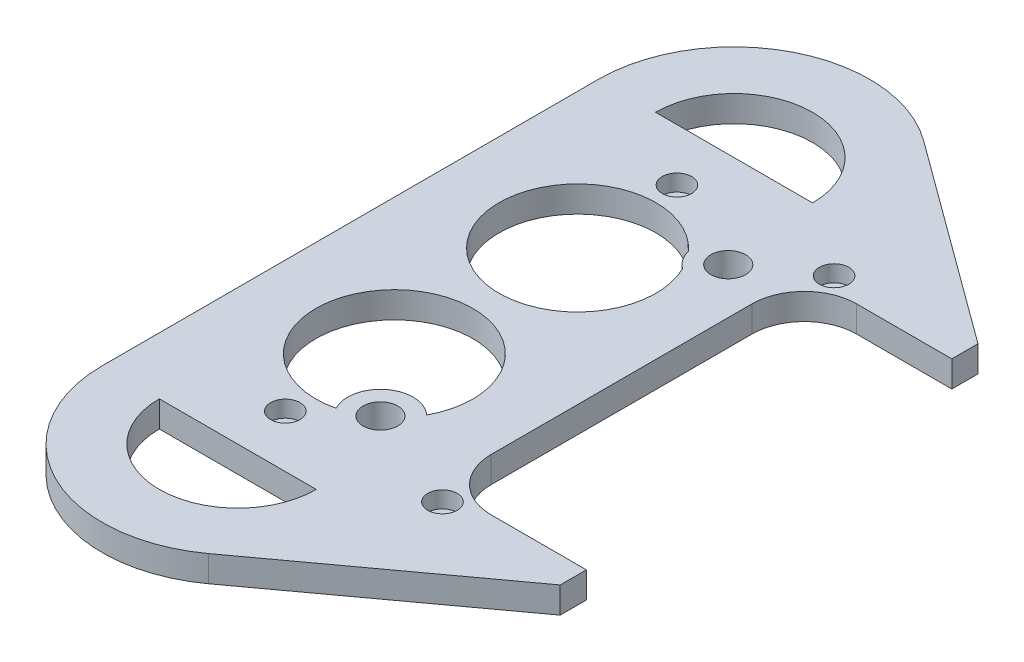
ISO-10303-21;
HEADER;
FILE_DESCRIPTION(('STEP AP214'),'2;1');
FILE_NAME('part.step','',(''),(''),'','','');
FILE_SCHEMA(('AUTOMOTIVE_DESIGN { 1 0 10303 214 1 1 1 1 }'));
ENDSEC;
DATA;
#1=APPLICATION_CONTEXT('core data for automotive mechanical design processes');
#2=APPLICATION_PROTOCOL_DEFINITION('international standard','automotive_design',2000,#1);
#3=PRODUCT_CONTEXT('',#1,'mechanical');
#4=PRODUCT('Part','Part','',(#3));
#5=PRODUCT_RELATED_PRODUCT_CATEGORY('part','',(#4));
#6=PRODUCT_DEFINITION_FORMATION('','',#4);
#7=PRODUCT_DEFINITION_CONTEXT('part definition',#1,'design');
#8=PRODUCT_DEFINITION('design','',#6,#7);
#9=PRODUCT_DEFINITION_SHAPE('','',#8);
#10=(LENGTH_UNIT() NAMED_UNIT(*) SI_UNIT(.MILLI.,.METRE.));
#11=(NAMED_UNIT(*) PLANE_ANGLE_UNIT() SI_UNIT($,.RADIAN.));
#12=(NAMED_UNIT(*) SI_UNIT($,.STERADIAN.) SOLID_ANGLE_UNIT());
#13=UNCERTAINTY_MEASURE_WITH_UNIT(LENGTH_MEASURE(1.E-05),#10,'distance_accuracy_value','');
#14=(GEOMETRIC_REPRESENTATION_CONTEXT(3) GLOBAL_UNCERTAINTY_ASSIGNED_CONTEXT((#13)) GLOBAL_UNIT_ASSIGNED_CONTEXT((#10,
#11,#12)) REPRESENTATION_CONTEXT('',''));
#15=CARTESIAN_POINT('',(0.,0.,0.));
#16=DIRECTION('',(0.,0.,1.));
#17=DIRECTION('',(1.,0.,0.));
#18=AXIS2_PLACEMENT_3D('',#15,#16,#17);
#19=CARTESIAN_POINT('',(-34.3669284746665,59.628467801772,9.525));
#20=DIRECTION('',(0.,-1.,0.));
#21=DIRECTION('',(0.,0.,-1.));
#22=AXIS2_PLACEMENT_3D('',#19,#20,#21);
#23=CYLINDRICAL_SURFACE('',#22,19.05);
#24=CARTESIAN_POINT('',(-34.3669284746665,53.278467801772,9.525));
#25=DIRECTION('',(0.,1.,0.));
#26=DIRECTION('',(0.,0.,1.));
#27=AXIS2_PLACEMENT_3D('',#24,#25,#26);
#28=CIRCLE('',#27,19.05);
#29=CARTESIAN_POINT('',(-53.4169284746665,53.278467801772,9.525));
#30=VERTEX_POINT('',#29);
#31=CARTESIAN_POINT('',(-15.3169284746665,53.278467801772,9.52500000000001));
#32=VERTEX_POINT('',#31);
#33=EDGE_CURVE('E193',#30,#32,#28,.T.);
#34=ORIENTED_EDGE('',*,*,#33,.F.);
#35=DIRECTION('',(0.,-1.,0.));
#36=VECTOR('',#35,1.);
#37=CARTESIAN_POINT('',(-53.4169284746665,59.628467801772,9.525));
#38=LINE('',#37,#36);
#39=CARTESIAN_POINT('',(-53.4169284746665,59.628467801772,9.525));
#40=VERTEX_POINT('',#39);
#41=EDGE_CURVE('E287',#40,#30,#38,.T.);
#42=ORIENTED_EDGE('',*,*,#41,.F.);
#43=CARTESIAN_POINT('',(-34.3669284746665,59.628467801772,9.525));
#44=DIRECTION('',(0.,1.,0.));
#45=DIRECTION('',(0.,0.,1.));
#46=AXIS2_PLACEMENT_3D('',#43,#44,#45);
#47=CIRCLE('',#46,19.05);
#48=CARTESIAN_POINT('',(-15.3169284746665,59.628467801772,9.52500000000001));
#49=VERTEX_POINT('',#48);
#50=EDGE_CURVE('E235',#40,#49,#47,.T.);
#51=ORIENTED_EDGE('',*,*,#50,.T.);
#52=DIRECTION('',(0.,-1.,0.));
#53=VECTOR('',#52,1.);
#54=CARTESIAN_POINT('',(-15.3169284746665,59.628467801772,9.52500000000001));
#55=LINE('',#54,#53);
#56=EDGE_CURVE('E285',#49,#32,#55,.T.);
#57=ORIENTED_EDGE('',*,*,#56,.T.);
#58=EDGE_LOOP('',(#34,#42,#51,#57));
#59=FACE_BOUND('',#58,.T.);
#60=ADVANCED_FACE('F34',(#59),#23,.F.);
#61=CARTESIAN_POINT('',(-34.3669284746665,59.628467801772,-110.914407138914));
#62=DIRECTION('',(0.,-1.,0.));
#63=DIRECTION('',(0.,0.,-1.));
#64=AXIS2_PLACEMENT_3D('',#61,#62,#63);
#65=CYLINDRICAL_SURFACE('',#64,19.05);
#66=CARTESIAN_POINT('',(-34.3669284746665,53.278467801772,-110.914407138914));
#67=DIRECTION('',(0.,1.,0.));
#68=DIRECTION('',(0.,0.,1.));
#69=AXIS2_PLACEMENT_3D('',#66,#67,#68);
#70=CIRCLE('',#69,19.05);
#71=CARTESIAN_POINT('',(-15.3169284746665,53.278467801772,-110.914407138914));
#72=VERTEX_POINT('',#71);
#73=CARTESIAN_POINT('',(-53.4169284746665,53.278467801772,-110.914407138914));
#74=VERTEX_POINT('',#73);
#75=EDGE_CURVE('E277',#72,#74,#70,.T.);
#76=ORIENTED_EDGE('',*,*,#75,.F.);
#77=DIRECTION('',(0.,-1.,0.));
#78=VECTOR('',#77,1.);
#79=CARTESIAN_POINT('',(-15.3169284746665,59.628467801772,-110.914407138914));
#80=LINE('',#79,#78);
#81=CARTESIAN_POINT('',(-15.3169284746665,59.628467801772,-110.914407138914));
#82=VERTEX_POINT('',#81);
#83=EDGE_CURVE('E288',#82,#72,#80,.T.);
#84=ORIENTED_EDGE('',*,*,#83,.F.);
#85=CARTESIAN_POINT('',(-34.3669284746665,59.628467801772,-110.914407138914));
#86=DIRECTION('',(0.,1.,0.));
#87=DIRECTION('',(0.,0.,1.));
#88=AXIS2_PLACEMENT_3D('',#85,#86,#87);
#89=CIRCLE('',#88,19.05);
#90=CARTESIAN_POINT('',(-53.4169284746665,59.628467801772,-110.914407138914));
#91=VERTEX_POINT('',#90);
#92=EDGE_CURVE('E230',#82,#91,#89,.T.);
#93=ORIENTED_EDGE('',*,*,#92,.T.);
#94=DIRECTION('',(0.,-1.,0.));
#95=VECTOR('',#94,1.);
#96=CARTESIAN_POINT('',(-53.4169284746665,59.628467801772,-110.914407138914));
#97=LINE('',#96,#95);
#98=EDGE_CURVE('E291',#91,#74,#97,.T.);
#99=ORIENTED_EDGE('',*,*,#98,.T.);
#100=EDGE_LOOP('',(#76,#84,#93,#99));
#101=FACE_BOUND('',#100,.T.);
#102=ADVANCED_FACE('F387',(#101),#65,.F.);
#103=CARTESIAN_POINT('',(-34.3669284746665,59.628467801772,-28.4697035694572));
#104=DIRECTION('',(0.,-1.,0.));
#105=DIRECTION('',(0.,0.,-1.));
#106=AXIS2_PLACEMENT_3D('',#103,#104,#105);
#107=CYLINDRICAL_SURFACE('',#106,19.05);
#108=CARTESIAN_POINT('',(-34.3669284746665,53.278467801772,-28.4697035694572));
#109=DIRECTION('',(0.,1.,0.));
#110=DIRECTION('',(0.,0.,1.));
#111=AXIS2_PLACEMENT_3D('',#108,#109,#110);
#112=CIRCLE('',#111,19.05);
#113=CARTESIAN_POINT('',(-17.5600046439116,53.278467801772,-19.5014366606725));
#114=VERTEX_POINT('',#113);
#115=CARTESIAN_POINT('',(-29.9619169320867,53.278467801772,-9.93599446119345));
#116=VERTEX_POINT('',#115);
#117=EDGE_CURVE('E271',#114,#116,#112,.T.);
#118=ORIENTED_EDGE('',*,*,#117,.F.);
#119=DIRECTION('',(0.,-1.,0.));
#120=VECTOR('',#119,1.);
#121=CARTESIAN_POINT('',(-17.5600046439116,59.628467801772,-19.5014366606725));
#122=LINE('',#121,#120);
#123=CARTESIAN_POINT('',(-17.5600046439116,59.628467801772,-19.5014366606725));
#124=VERTEX_POINT('',#123);
#125=EDGE_CURVE('E293',#124,#114,#122,.T.);
#126=ORIENTED_EDGE('',*,*,#125,.F.);
#127=CARTESIAN_POINT('',(-34.3669284746665,59.628467801772,-28.4697035694572));
#128=DIRECTION('',(0.,1.,0.));
#129=DIRECTION('',(0.,0.,1.));
#130=AXIS2_PLACEMENT_3D('',#127,#128,#129);
#131=CIRCLE('',#130,19.05);
#132=CARTESIAN_POINT('',(-29.9619169320867,59.628467801772,-9.93599446119345));
#133=VERTEX_POINT('',#132);
#134=EDGE_CURVE('E225',#124,#133,#131,.T.);
#135=ORIENTED_EDGE('',*,*,#134,.T.);
#136=DIRECTION('',(0.,-1.,0.));
#137=VECTOR('',#136,1.);
#138=CARTESIAN_POINT('',(-29.9619169320867,59.628467801772,-9.93599446119345));
#139=LINE('',#138,#137);
#140=EDGE_CURVE('E295',#133,#116,#139,.T.);
#141=ORIENTED_EDGE('',*,*,#140,.T.);
#142=EDGE_LOOP('',(#118,#126,#135,#141));
#143=FACE_BOUND('',#142,.T.);
#144=ADVANCED_FACE('F393',(#143),#107,.F.);
#145=CARTESIAN_POINT('',(-1.4507191224685,59.628467801772,0.));
#146=DIRECTION('',(1.,0.,0.));
#147=DIRECTION('',(0.,0.,-1.));
#148=AXIS2_PLACEMENT_3D('',#145,#146,#147);
#149=PLANE('',#148);
#150=DIRECTION('',(0.,0.,1.));
#151=VECTOR('',#150,1.);
#152=CARTESIAN_POINT('',(-1.4507191224685,53.278467801772,0.));
#153=LINE('',#152,#151);
#154=CARTESIAN_POINT('',(-1.4507191224685,53.278467801772,-82.3394036822282));
#155=VERTEX_POINT('',#154);
#156=CARTESIAN_POINT('',(-1.4507191224685,53.278467801772,-19.05));
#157=VERTEX_POINT('',#156);
#158=EDGE_CURVE('E244',#155,#157,#153,.T.);
#159=ORIENTED_EDGE('',*,*,#158,.F.);
#160=DIRECTION('',(0.,-1.,0.));
#161=VECTOR('',#160,1.);
#162=CARTESIAN_POINT('',(-1.4507191224685,59.628467801772,-82.3394036822282));
#163=LINE('',#162,#161);
#164=CARTESIAN_POINT('',(-1.4507191224685,59.628467801772,-82.3394036822282));
#165=VERTEX_POINT('',#164);
#166=EDGE_CURVE('E325',#155,#165,#163,.F.);
#167=ORIENTED_EDGE('',*,*,#166,.T.);
#168=DIRECTION('',(0.,0.,1.));
#169=VECTOR('',#168,1.);
#170=CARTESIAN_POINT('',(-1.4507191224685,59.628467801772,0.));
#171=LINE('',#170,#169);
#172=CARTESIAN_POINT('',(-1.4507191224685,59.628467801772,-19.05));
#173=VERTEX_POINT('',#172);
#174=EDGE_CURVE('E186',#165,#173,#171,.T.);
#175=ORIENTED_EDGE('',*,*,#174,.T.);
#176=DIRECTION('',(0.,-1.,0.));
#177=VECTOR('',#176,1.);
#178=CARTESIAN_POINT('',(-1.4507191224685,53.278467801772,-19.05));
#179=LINE('',#178,#177);
#180=EDGE_CURVE('E322',#173,#157,#179,.T.);
#181=ORIENTED_EDGE('',*,*,#180,.T.);
#182=EDGE_LOOP('',(#159,#167,#175,#181));
#183=FACE_BOUND('',#182,.T.);
#184=ADVANCED_FACE('F349',(#183),#149,.T.);
#185=CARTESIAN_POINT('',(0.,59.628467801772,-95.0394036822282));
#186=DIRECTION('',(0.,0.,-1.));
#187=DIRECTION('',(-1.,0.,0.));
#188=AXIS2_PLACEMENT_3D('',#185,#186,#187);
#189=PLANE('',#188);
#190=DIRECTION('',(1.,0.,0.));
#191=VECTOR('',#190,1.);
#192=CARTESIAN_POINT('',(0.,59.628467801772,-95.0394036822282));
#193=LINE('',#192,#191);
#194=CARTESIAN_POINT('',(11.2492808775315,59.628467801772,-95.0394036822282));
#195=VERTEX_POINT('',#194);
#196=CARTESIAN_POINT('',(34.354322218472,59.628467801772,-95.0394036822282));
#197=VERTEX_POINT('',#196);
#198=EDGE_CURVE('E201',#195,#197,#193,.T.);
#199=ORIENTED_EDGE('',*,*,#198,.F.);
#200=DIRECTION('',(0.,-1.,0.));
#201=VECTOR('',#200,1.);
#202=CARTESIAN_POINT('',(11.2492808775315,59.628467801772,-95.0394036822282));
#203=LINE('',#202,#201);
#204=CARTESIAN_POINT('',(11.2492808775315,53.278467801772,-95.0394036822282));
#205=VERTEX_POINT('',#204);
#206=EDGE_CURVE('E290',#195,#205,#203,.T.);
#207=ORIENTED_EDGE('',*,*,#206,.T.);
#208=DIRECTION('',(1.,0.,0.));
#209=VECTOR('',#208,1.);
#210=CARTESIAN_POINT('',(0.,53.278467801772,-95.0394036822282));
#211=LINE('',#210,#209);
#212=CARTESIAN_POINT('',(34.354322218472,53.278467801772,-95.0394036822282));
#213=VERTEX_POINT('',#212);
#214=EDGE_CURVE('E246',#205,#213,#211,.T.);
#215=ORIENTED_EDGE('',*,*,#214,.T.);
#216=DIRECTION('',(0.,-1.,0.));
#217=VECTOR('',#216,1.);
#218=CARTESIAN_POINT('',(34.354322218472,59.628467801772,-95.0394036822282));
#219=LINE('',#218,#217);
#220=EDGE_CURVE('E297',#197,#213,#219,.T.);
#221=ORIENTED_EDGE('',*,*,#220,.F.);
#222=EDGE_LOOP('',(#199,#207,#215,#221));
#223=FACE_BOUND('',#222,.T.);
#224=ADVANCED_FACE('F341',(#223),#189,.F.);
#225=CARTESIAN_POINT('',(34.354322218472,59.628467801772,0.));
#226=DIRECTION('',(-1.,0.,0.));
#227=DIRECTION('',(0.,0.,1.));
#228=AXIS2_PLACEMENT_3D('',#225,#226,#227);
#229=PLANE('',#228);
#230=DIRECTION('',(0.,0.,-1.));
#231=VECTOR('',#230,1.);
#232=CARTESIAN_POINT('',(34.354322218472,53.278467801772,0.));
#233=LINE('',#232,#231);
#234=CARTESIAN_POINT('',(34.354322218472,53.278467801772,-101.389403682228));
#235=VERTEX_POINT('',#234);
#236=EDGE_CURVE('E248',#213,#235,#233,.T.);
#237=ORIENTED_EDGE('',*,*,#236,.T.);
#238=DIRECTION('',(0.,-1.,0.));
#239=VECTOR('',#238,1.);
#240=CARTESIAN_POINT('',(34.354322218472,59.628467801772,-101.389403682228));
#241=LINE('',#240,#239);
#242=CARTESIAN_POINT('',(34.354322218472,59.628467801772,-101.389403682228));
#243=VERTEX_POINT('',#242);
#244=EDGE_CURVE('E314',#243,#235,#241,.T.);
#245=ORIENTED_EDGE('',*,*,#244,.F.);
#246=DIRECTION('',(0.,0.,-1.));
#247=VECTOR('',#246,1.);
#248=CARTESIAN_POINT('',(34.354322218472,59.628467801772,0.));
#249=LINE('',#248,#247);
#250=EDGE_CURVE('E203',#197,#243,#249,.T.);
#251=ORIENTED_EDGE('',*,*,#250,.F.);
#252=ORIENTED_EDGE('',*,*,#220,.T.);
#253=EDGE_LOOP('',(#237,#245,#251,#252));
#254=FACE_BOUND('',#253,.T.);
#255=ADVANCED_FACE('F377',(#254),#229,.F.);
#256=CARTESIAN_POINT('',(60.3209496971366,59.628467801772,-82.3746823463897));
#257=DIRECTION('',(-0.590808443282983,0.,0.806811863661869));
#258=DIRECTION('',(0.806811863661869,0.,0.590808443282983));
#259=AXIS2_PLACEMENT_3D('',#256,#257,#258);
#260=PLANE('',#259);
#261=DIRECTION('',(-0.806811863661869,0.,-0.590808443282983));
#262=VECTOR('',#261,1.);
#263=CARTESIAN_POINT('',(60.3209496971366,53.278467801772,-82.3746823463897));
#264=LINE('',#263,#262);
#265=CARTESIAN_POINT('',(-14.9197540685176,53.278467801772,-137.471595351046));
#266=VERTEX_POINT('',#265);
#267=EDGE_CURVE('E251',#235,#266,#264,.T.);
#268=ORIENTED_EDGE('',*,*,#267,.T.);
#269=DIRECTION('',(0.,-1.,0.));
#270=VECTOR('',#269,1.);
#271=CARTESIAN_POINT('',(-14.9197540685176,59.628467801772,-137.471595351046));
#272=LINE('',#271,#270);
#273=CARTESIAN_POINT('',(-14.9197540685176,59.628467801772,-137.471595351046));
#274=VERTEX_POINT('',#273);
#275=EDGE_CURVE('E311',#274,#266,#272,.T.);
#276=ORIENTED_EDGE('',*,*,#275,.F.);
#277=DIRECTION('',(-0.806811863661869,0.,-0.590808443282983));
#278=VECTOR('',#277,1.);
#279=CARTESIAN_POINT('',(60.3209496971366,59.628467801772,-82.3746823463897));
#280=LINE('',#279,#278);
#281=EDGE_CURVE('E206',#243,#274,#280,.T.);
#282=ORIENTED_EDGE('',*,*,#281,.F.);
#283=ORIENTED_EDGE('',*,*,#244,.T.);
#284=EDGE_LOOP('',(#268,#276,#282,#283));
#285=FACE_BOUND('',#284,.T.);
#286=ADVANCED_FACE('F374',(#285),#260,.F.);
#287=CARTESIAN_POINT('',(-34.3669284746665,59.628467801772,-110.914407138914));
#288=DIRECTION('',(0.,-1.,0.));
#289=DIRECTION('',(0.,0.,-1.));
#290=AXIS2_PLACEMENT_3D('',#287,#288,#289);
#291=CYLINDRICAL_SURFACE('',#290,32.916209352198);
#292=CARTESIAN_POINT('',(-34.3669284746665,53.278467801772,-110.914407138914));
#293=DIRECTION('',(0.,1.,0.));
#294=DIRECTION('',(0.,0.,1.));
#295=AXIS2_PLACEMENT_3D('',#292,#293,#294);
#296=CIRCLE('',#295,32.916209352198);
#297=CARTESIAN_POINT('',(-67.2831378268646,53.278467801772,-110.914407138914));
#298=VERTEX_POINT('',#297);
#299=EDGE_CURVE('E254',#266,#298,#296,.T.);
#300=ORIENTED_EDGE('',*,*,#299,.T.);
#301=DIRECTION('',(0.,-1.,0.));
#302=VECTOR('',#301,1.);
#303=CARTESIAN_POINT('',(-67.2831378268646,59.628467801772,-110.914407138914));
#304=LINE('',#303,#302);
#305=CARTESIAN_POINT('',(-67.2831378268646,59.628467801772,-110.914407138914));
#306=VERTEX_POINT('',#305);
#307=EDGE_CURVE('E308',#306,#298,#304,.T.);
#308=ORIENTED_EDGE('',*,*,#307,.F.);
#309=CARTESIAN_POINT('',(-34.3669284746665,59.628467801772,-110.914407138914));
#310=DIRECTION('',(0.,1.,0.));
#311=DIRECTION('',(0.,0.,1.));
#312=AXIS2_PLACEMENT_3D('',#309,#310,#311);
#313=CIRCLE('',#312,32.916209352198);
#314=EDGE_CURVE('E209',#274,#306,#313,.T.);
#315=ORIENTED_EDGE('',*,*,#314,.F.);
#316=ORIENTED_EDGE('',*,*,#275,.T.);
#317=EDGE_LOOP('',(#300,#308,#315,#316));
#318=FACE_BOUND('',#317,.T.);
#319=ADVANCED_FACE('F371',(#318),#291,.T.);
#320=CARTESIAN_POINT('',(-67.2831378268646,59.628467801772,0.));
#321=DIRECTION('',(1.,0.,0.));
#322=DIRECTION('',(0.,0.,-1.));
#323=AXIS2_PLACEMENT_3D('',#320,#321,#322);
#324=PLANE('',#323);
#325=DIRECTION('',(0.,0.,1.));
#326=VECTOR('',#325,1.);
#327=CARTESIAN_POINT('',(-67.2831378268646,53.278467801772,0.));
#328=LINE('',#327,#326);
#329=CARTESIAN_POINT('',(-67.2831378268646,53.278467801772,9.525));
#330=VERTEX_POINT('',#329);
#331=EDGE_CURVE('E257',#298,#330,#328,.T.);
#332=ORIENTED_EDGE('',*,*,#331,.T.);
#333=DIRECTION('',(0.,-1.,0.));
#334=VECTOR('',#333,1.);
#335=CARTESIAN_POINT('',(-67.2831378268646,59.628467801772,9.525));
#336=LINE('',#335,#334);
#337=CARTESIAN_POINT('',(-67.2831378268646,59.628467801772,9.525));
#338=VERTEX_POINT('',#337);
#339=EDGE_CURVE('E305',#338,#330,#336,.T.);
#340=ORIENTED_EDGE('',*,*,#339,.F.);
#341=DIRECTION('',(0.,0.,1.));
#342=VECTOR('',#341,1.);
#343=CARTESIAN_POINT('',(-67.2831378268646,59.628467801772,0.));
#344=LINE('',#343,#342);
#345=EDGE_CURVE('E212',#306,#338,#344,.T.);
#346=ORIENTED_EDGE('',*,*,#345,.F.);
#347=ORIENTED_EDGE('',*,*,#307,.T.);
#348=EDGE_LOOP('',(#332,#340,#346,#347));
#349=FACE_BOUND('',#348,.T.);
#350=ADVANCED_FACE('F369',(#349),#324,.F.);
#351=CARTESIAN_POINT('',(-34.3669284746665,59.628467801772,9.525));
#352=DIRECTION('',(0.,-1.,0.));
#353=DIRECTION('',(0.,0.,-1.));
#354=AXIS2_PLACEMENT_3D('',#351,#352,#353);
#355=CYLINDRICAL_SURFACE('',#354,32.916209352198);
#356=CARTESIAN_POINT('',(-34.3669284746665,53.278467801772,9.525));
#357=DIRECTION('',(0.,1.,0.));
#358=DIRECTION('',(0.,0.,1.));
#359=AXIS2_PLACEMENT_3D('',#356,#357,#358);
#360=CIRCLE('',#359,32.916209352198);
#361=CARTESIAN_POINT('',(-14.9197552812588,53.278467801772,36.0821891001916));
#362=VERTEX_POINT('',#361);
#363=EDGE_CURVE('E260',#330,#362,#360,.T.);
#364=ORIENTED_EDGE('',*,*,#363,.T.);
#365=DIRECTION('',(0.,-1.,0.));
#366=VECTOR('',#365,1.);
#367=CARTESIAN_POINT('',(-14.9197552812588,59.628467801772,36.0821891001916));
#368=LINE('',#367,#366);
#369=CARTESIAN_POINT('',(-14.9197552812588,59.628467801772,36.0821891001916));
#370=VERTEX_POINT('',#369);
#371=EDGE_CURVE('E303',#370,#362,#368,.T.);
#372=ORIENTED_EDGE('',*,*,#371,.F.);
#373=CARTESIAN_POINT('',(-34.3669284746665,59.628467801772,9.525));
#374=DIRECTION('',(0.,1.,0.));
#375=DIRECTION('',(0.,0.,1.));
#376=AXIS2_PLACEMENT_3D('',#373,#374,#375);
#377=CIRCLE('',#376,32.916209352198);
#378=EDGE_CURVE('E215',#338,#370,#377,.T.);
#379=ORIENTED_EDGE('',*,*,#378,.F.);
#380=ORIENTED_EDGE('',*,*,#339,.T.);
#381=EDGE_LOOP('',(#364,#372,#379,#380));
#382=FACE_BOUND('',#381,.T.);
#383=ADVANCED_FACE('F365',(#382),#355,.T.);
#384=CARTESIAN_POINT('',(11.9915332767895,59.628467801772,16.37571762568));
#385=DIRECTION('',(0.590808406439701,0.,0.806811890641295));
#386=DIRECTION('',(0.806811890641295,0.,-0.590808406439701));
#387=AXIS2_PLACEMENT_3D('',#384,#385,#386);
#388=PLANE('',#387);
#389=DIRECTION('',(-0.806811890641295,0.,0.590808406439701));
#390=VECTOR('',#389,1.);
#391=CARTESIAN_POINT('',(11.9915332767895,53.278467801772,16.37571762568));
#392=LINE('',#391,#390);
#393=CARTESIAN_POINT('',(34.354322218472,53.278467801772,0.));
#394=VERTEX_POINT('',#393);
#395=EDGE_CURVE('E263',#394,#362,#392,.T.);
#396=ORIENTED_EDGE('',*,*,#395,.F.);
#397=DIRECTION('',(0.,-1.,0.));
#398=VECTOR('',#397,1.);
#399=CARTESIAN_POINT('',(34.354322218472,59.628467801772,0.));
#400=LINE('',#399,#398);
#401=CARTESIAN_POINT('',(34.354322218472,59.628467801772,0.));
#402=VERTEX_POINT('',#401);
#403=EDGE_CURVE('E301',#402,#394,#400,.T.);
#404=ORIENTED_EDGE('',*,*,#403,.F.);
#405=DIRECTION('',(-0.806811890641295,0.,0.590808406439701));
#406=VECTOR('',#405,1.);
#407=CARTESIAN_POINT('',(11.9915332767895,59.628467801772,16.37571762568));
#408=LINE('',#407,#406);
#409=EDGE_CURVE('E217',#402,#370,#408,.T.);
#410=ORIENTED_EDGE('',*,*,#409,.T.);
#411=ORIENTED_EDGE('',*,*,#371,.T.);
#412=EDGE_LOOP('',(#396,#404,#410,#411));
#413=FACE_BOUND('',#412,.T.);
#414=ADVANCED_FACE('F362',(#413),#388,.T.);
#415=CARTESIAN_POINT('',(34.354322218472,59.628467801772,0.));
#416=DIRECTION('',(-1.,0.,0.));
#417=DIRECTION('',(0.,0.,1.));
#418=AXIS2_PLACEMENT_3D('',#415,#416,#417);
#419=PLANE('',#418);
#420=DIRECTION('',(0.,0.,-1.));
#421=VECTOR('',#420,1.);
#422=CARTESIAN_POINT('',(34.354322218472,53.278467801772,0.));
#423=LINE('',#422,#421);
#424=CARTESIAN_POINT('',(34.354322218472,53.278467801772,-6.35));
#425=VERTEX_POINT('',#424);
#426=EDGE_CURVE('E266',#394,#425,#423,.T.);
#427=ORIENTED_EDGE('',*,*,#426,.T.);
#428=DIRECTION('',(0.,-1.,0.));
#429=VECTOR('',#428,1.);
#430=CARTESIAN_POINT('',(34.354322218472,59.628467801772,-6.35));
#431=LINE('',#430,#429);
#432=CARTESIAN_POINT('',(34.354322218472,59.628467801772,-6.35));
#433=VERTEX_POINT('',#432);
#434=EDGE_CURVE('E179',#433,#425,#431,.T.);
#435=ORIENTED_EDGE('',*,*,#434,.F.);
#436=DIRECTION('',(0.,0.,-1.));
#437=VECTOR('',#436,1.);
#438=CARTESIAN_POINT('',(34.354322218472,59.628467801772,0.));
#439=LINE('',#438,#437);
#440=EDGE_CURVE('E220',#402,#433,#439,.T.);
#441=ORIENTED_EDGE('',*,*,#440,.F.);
#442=ORIENTED_EDGE('',*,*,#403,.T.);
#443=EDGE_LOOP('',(#427,#435,#441,#442));
#444=FACE_BOUND('',#443,.T.);
#445=ADVANCED_FACE('F359',(#444),#419,.F.);
#446=CARTESIAN_POINT('',(-34.3669284746665,59.628467801772,-72.9197035694572));
#447=DIRECTION('',(0.,-1.,0.));
#448=DIRECTION('',(0.,0.,-1.));
#449=AXIS2_PLACEMENT_3D('',#446,#447,#448);
#450=CYLINDRICAL_SURFACE('',#449,19.05);
#451=CARTESIAN_POINT('',(-34.3669284746665,53.278467801772,-72.9197035694572));
#452=DIRECTION('',(0.,1.,0.));
#453=DIRECTION('',(0.,0.,1.));
#454=AXIS2_PLACEMENT_3D('',#451,#452,#453);
#455=CIRCLE('',#454,19.05);
#456=CARTESIAN_POINT('',(-20.2477707652336,53.278467801772,-85.7084441476439));
#457=VERTEX_POINT('',#456);
#458=CARTESIAN_POINT('',(-17.2569267758607,53.278467801772,-81.2952836608217));
#459=VERTEX_POINT('',#458);
#460=EDGE_CURVE('E175',#457,#459,#455,.T.);
#461=ORIENTED_EDGE('',*,*,#460,.F.);
#462=DIRECTION('',(0.,-1.,0.));
#463=VECTOR('',#462,1.);
#464=CARTESIAN_POINT('',(-20.2477707652336,59.628467801772,-85.7084441476439));
#465=LINE('',#464,#463);
#466=CARTESIAN_POINT('',(-20.2477707652336,59.628467801772,-85.7084441476439));
#467=VERTEX_POINT('',#466);
#468=EDGE_CURVE('E169',#467,#457,#465,.T.);
#469=ORIENTED_EDGE('',*,*,#468,.F.);
#470=CARTESIAN_POINT('',(-34.3669284746665,59.628467801772,-72.9197035694572));
#471=DIRECTION('',(0.,1.,0.));
#472=DIRECTION('',(0.,0.,1.));
#473=AXIS2_PLACEMENT_3D('',#470,#471,#472);
#474=CIRCLE('',#473,19.05);
#475=CARTESIAN_POINT('',(-17.2569267758607,59.628467801772,-81.2952836608217));
#476=VERTEX_POINT('',#475);
#477=EDGE_CURVE('E173',#467,#476,#474,.T.);
#478=ORIENTED_EDGE('',*,*,#477,.T.);
#479=DIRECTION('',(0.,-1.,0.));
#480=VECTOR('',#479,1.);
#481=CARTESIAN_POINT('',(-17.2569267758607,59.628467801772,-81.2952836608217));
#482=LINE('',#481,#480);
#483=EDGE_CURVE('E180',#476,#459,#482,.T.);
#484=ORIENTED_EDGE('',*,*,#483,.T.);
#485=EDGE_LOOP('',(#461,#469,#478,#484));
#486=FACE_BOUND('',#485,.T.);
#487=ADVANCED_FACE('F171',(#486),#450,.F.);
#488=CARTESIAN_POINT('',(0.,59.628467801772,-110.914407138914));
#489=DIRECTION('',(0.,0.,1.));
#490=DIRECTION('',(1.,0.,0.));
#491=AXIS2_PLACEMENT_3D('',#488,#489,#490);
#492=PLANE('',#491);
#493=DIRECTION('',(-1.,0.,0.));
#494=VECTOR('',#493,1.);
#495=CARTESIAN_POINT('',(0.,53.278467801772,-110.914407138914));
#496=LINE('',#495,#494);
#497=EDGE_CURVE('E280',#72,#74,#496,.T.);
#498=ORIENTED_EDGE('',*,*,#497,.T.);
#499=ORIENTED_EDGE('',*,*,#98,.F.);
#500=DIRECTION('',(-1.,0.,0.));
#501=VECTOR('',#500,1.);
#502=CARTESIAN_POINT('',(0.,59.628467801772,-110.914407138914));
#503=LINE('',#502,#501);
#504=EDGE_CURVE('E233',#82,#91,#503,.T.);
#505=ORIENTED_EDGE('',*,*,#504,.F.);
#506=ORIENTED_EDGE('',*,*,#83,.T.);
#507=EDGE_LOOP('',(#498,#499,#505,#506));
#508=FACE_BOUND('',#507,.T.);
#509=ADVANCED_FACE('F401',(#508),#492,.F.);
#510=CARTESIAN_POINT('',(-22.9699187043963,59.628467801772,-13.6931033275924));
#511=DIRECTION('',(0.,-1.,0.));
#512=DIRECTION('',(0.,0.,-1.));
#513=AXIS2_PLACEMENT_3D('',#510,#511,#512);
#514=CYLINDRICAL_SURFACE('',#513,7.9375);
#515=CARTESIAN_POINT('',(-22.9699187043963,53.278467801772,-13.6931033275924));
#516=DIRECTION('',(0.,1.,0.));
#517=DIRECTION('',(0.,0.,1.));
#518=AXIS2_PLACEMENT_3D('',#515,#516,#517);
#519=CIRCLE('',#518,7.9375);
#520=EDGE_CURVE('E274',#114,#116,#519,.T.);
#521=ORIENTED_EDGE('',*,*,#520,.T.);
#522=ORIENTED_EDGE('',*,*,#140,.F.);
#523=CARTESIAN_POINT('',(-22.9699187043963,59.628467801772,-13.6931033275924));
#524=DIRECTION('',(0.,1.,0.));
#525=DIRECTION('',(0.,0.,1.));
#526=AXIS2_PLACEMENT_3D('',#523,#524,#525);
#527=CIRCLE('',#526,7.9375);
#528=EDGE_CURVE('E228',#124,#133,#527,.T.);
#529=ORIENTED_EDGE('',*,*,#528,.F.);
#530=ORIENTED_EDGE('',*,*,#125,.T.);
#531=EDGE_LOOP('',(#521,#522,#529,#530));
#532=FACE_BOUND('',#531,.T.);
#533=ADVANCED_FACE('F403',(#532),#514,.T.);
#534=CARTESIAN_POINT('',(0.,59.628467801772,-6.35));
#535=DIRECTION('',(0.,0.,-1.));
#536=DIRECTION('',(-1.,0.,0.));
#537=AXIS2_PLACEMENT_3D('',#534,#535,#536);
#538=PLANE('',#537);
#539=DIRECTION('',(1.,0.,0.));
#540=VECTOR('',#539,1.);
#541=CARTESIAN_POINT('',(0.,53.278467801772,-6.35));
#542=LINE('',#541,#540);
#543=CARTESIAN_POINT('',(11.2492808775315,53.278467801772,-6.35));
#544=VERTEX_POINT('',#543);
#545=EDGE_CURVE('E269',#544,#425,#542,.T.);
#546=ORIENTED_EDGE('',*,*,#545,.F.);
#547=DIRECTION('',(0.,-1.,0.));
#548=VECTOR('',#547,1.);
#549=CARTESIAN_POINT('',(11.2492808775315,59.628467801772,-6.35));
#550=LINE('',#549,#548);
#551=CARTESIAN_POINT('',(11.2492808775315,59.628467801772,-6.35));
#552=VERTEX_POINT('',#551);
#553=EDGE_CURVE('E49',#544,#552,#550,.F.);
#554=ORIENTED_EDGE('',*,*,#553,.T.);
#555=DIRECTION('',(1.,0.,0.));
#556=VECTOR('',#555,1.);
#557=CARTESIAN_POINT('',(0.,59.628467801772,-6.35));
#558=LINE('',#557,#556);
#559=EDGE_CURVE('E223',#552,#433,#558,.T.);
#560=ORIENTED_EDGE('',*,*,#559,.T.);
#561=ORIENTED_EDGE('',*,*,#434,.T.);
#562=EDGE_LOOP('',(#546,#554,#560,#561));
#563=FACE_BOUND('',#562,.T.);
#564=ADVANCED_FACE('F356',(#563),#538,.T.);
#565=CARTESIAN_POINT('',(-12.5632191224685,59.628467801772,-87.6963003546359));
#566=DIRECTION('',(0.,-1.,0.));
#567=DIRECTION('',(0.,0.,-1.));
#568=AXIS2_PLACEMENT_3D('',#565,#566,#567);
#569=CYLINDRICAL_SURFACE('',#568,7.9375);
#570=CARTESIAN_POINT('',(-12.5632191224685,53.278467801772,-87.6963003546359));
#571=DIRECTION('',(0.,1.,0.));
#572=DIRECTION('',(0.,0.,1.));
#573=AXIS2_PLACEMENT_3D('',#570,#571,#572);
#574=CIRCLE('',#573,7.9375);
#575=EDGE_CURVE('E242',#457,#459,#574,.T.);
#576=ORIENTED_EDGE('',*,*,#575,.T.);
#577=ORIENTED_EDGE('',*,*,#483,.F.);
#578=CARTESIAN_POINT('',(-12.5632191224685,59.628467801772,-87.6963003546359));
#579=DIRECTION('',(0.,1.,0.));
#580=DIRECTION('',(0.,0.,1.));
#581=AXIS2_PLACEMENT_3D('',#578,#579,#580);
#582=CIRCLE('',#581,7.9375);
#583=EDGE_CURVE('E183',#467,#476,#582,.T.);
#584=ORIENTED_EDGE('',*,*,#583,.F.);
#585=ORIENTED_EDGE('',*,*,#468,.T.);
#586=EDGE_LOOP('',(#576,#577,#584,#585));
#587=FACE_BOUND('',#586,.T.);
#588=ADVANCED_FACE('F184',(#587),#569,.T.);
#589=CARTESIAN_POINT('',(0.,59.628467801772,9.52500000000001));
#590=DIRECTION('',(0.,0.,1.));
#591=DIRECTION('',(1.,0.,0.));
#592=AXIS2_PLACEMENT_3D('',#589,#590,#591);
#593=PLANE('',#592);
#594=DIRECTION('',(-1.,0.,0.));
#595=VECTOR('',#594,1.);
#596=CARTESIAN_POINT('',(0.,53.278467801772,9.52500000000001));
#597=LINE('',#596,#595);
#598=EDGE_CURVE('E190',#32,#30,#597,.T.);
#599=ORIENTED_EDGE('',*,*,#598,.F.);
#600=ORIENTED_EDGE('',*,*,#56,.F.);
#601=DIRECTION('',(-1.,0.,0.));
#602=VECTOR('',#601,1.);
#603=CARTESIAN_POINT('',(0.,59.628467801772,9.52500000000001));
#604=LINE('',#603,#602);
#605=EDGE_CURVE('E238',#49,#40,#604,.T.);
#606=ORIENTED_EDGE('',*,*,#605,.T.);
#607=ORIENTED_EDGE('',*,*,#41,.T.);
#608=EDGE_LOOP('',(#599,#600,#606,#607));
#609=FACE_BOUND('',#608,.T.);
#610=ADVANCED_FACE('F399',(#609),#593,.T.);
#611=CARTESIAN_POINT('',(0.,59.628467801772,0.));
#612=DIRECTION('',(0.,1.,0.));
#613=DIRECTION('',(0.,0.,1.));
#614=AXIS2_PLACEMENT_3D('',#611,#612,#613);
#615=PLANE('',#614);
#616=CARTESIAN_POINT('',(2.604322218472,59.628467801772,-3.17499999999999));
#617=DIRECTION('',(0.,1.,0.));
#618=DIRECTION('',(0.,0.,1.));
#619=AXIS2_PLACEMENT_3D('',#616,#617,#618);
#620=CIRCLE('',#619,3.57251);
#621=CARTESIAN_POINT('',(2.604322218472,59.628467801772,0.397510000000008));
#622=VERTEX_POINT('',#621);
#623=EDGE_CURVE('E772',#622,#622,#620,.T.);
#624=ORIENTED_EDGE('',*,*,#623,.F.);
#625=EDGE_LOOP('',(#624));
#626=FACE_BOUND('',#625,.T.);
#627=CARTESIAN_POINT('',(-35.5331378268646,59.628467801772,-3.17499999999999));
#628=DIRECTION('',(0.,1.,0.));
#629=DIRECTION('',(0.,0.,1.));
#630=AXIS2_PLACEMENT_3D('',#627,#628,#629);
#631=CIRCLE('',#630,3.57251);
#632=CARTESIAN_POINT('',(-35.5331378268646,59.628467801772,0.397510000000009));
#633=VERTEX_POINT('',#632);
#634=EDGE_CURVE('E782',#633,#633,#631,.T.);
#635=ORIENTED_EDGE('',*,*,#634,.F.);
#636=EDGE_LOOP('',(#635));
#637=FACE_BOUND('',#636,.T.);
#638=CARTESIAN_POINT('',(-35.5331378268646,59.628467801772,-98.2144036822282));
#639=DIRECTION('',(0.,1.,0.));
#640=DIRECTION('',(0.,0.,1.));
#641=AXIS2_PLACEMENT_3D('',#638,#639,#640);
#642=CIRCLE('',#641,3.57251);
#643=CARTESIAN_POINT('',(-35.5331378268646,59.628467801772,-94.6418936822282));
#644=VERTEX_POINT('',#643);
#645=EDGE_CURVE('E794',#644,#644,#642,.T.);
#646=ORIENTED_EDGE('',*,*,#645,.F.);
#647=EDGE_LOOP('',(#646));
#648=FACE_BOUND('',#647,.T.);
#649=CARTESIAN_POINT('',(2.604322218472,59.628467801772,-98.2144036822282));
#650=DIRECTION('',(0.,1.,0.));
#651=DIRECTION('',(0.,0.,1.));
#652=AXIS2_PLACEMENT_3D('',#649,#650,#651);
#653=CIRCLE('',#652,3.57251);
#654=CARTESIAN_POINT('',(2.604322218472,59.628467801772,-94.6418936822282));
#655=VERTEX_POINT('',#654);
#656=EDGE_CURVE('E806',#655,#655,#653,.T.);
#657=ORIENTED_EDGE('',*,*,#656,.F.);
#658=EDGE_LOOP('',(#657));
#659=FACE_BOUND('',#658,.T.);
#660=CARTESIAN_POINT('',(-22.9699187043963,59.628467801772,-13.6931033275924));
#661=DIRECTION('',(0.,1.,0.));
#662=DIRECTION('',(0.,0.,1.));
#663=AXIS2_PLACEMENT_3D('',#660,#661,#662);
#664=CIRCLE('',#663,4.2164);
#665=CARTESIAN_POINT('',(-22.9699187043963,59.628467801772,-9.47670332759238));
#666=VERTEX_POINT('',#665);
#667=EDGE_CURVE('E818',#666,#666,#664,.T.);
#668=ORIENTED_EDGE('',*,*,#667,.F.);
#669=EDGE_LOOP('',(#668));
#670=FACE_BOUND('',#669,.T.);
#671=CARTESIAN_POINT('',(-12.5632191224685,59.628467801772,-87.6963003546359));
#672=DIRECTION('',(0.,1.,0.));
#673=DIRECTION('',(0.,0.,1.));
#674=AXIS2_PLACEMENT_3D('',#671,#672,#673);
#675=CIRCLE('',#674,4.2164);
#676=CARTESIAN_POINT('',(-12.5632191224685,59.628467801772,-83.4799003546359));
#677=VERTEX_POINT('',#676);
#678=EDGE_CURVE('E823',#677,#677,#675,.T.);
#679=ORIENTED_EDGE('',*,*,#678,.F.);
#680=EDGE_LOOP('',(#679));
#681=FACE_BOUND('',#680,.T.);
#682=ORIENTED_EDGE('',*,*,#477,.F.);
#683=ORIENTED_EDGE('',*,*,#583,.T.);
#684=EDGE_LOOP('',(#682,#683));
#685=FACE_BOUND('',#684,.T.);
#686=ORIENTED_EDGE('',*,*,#174,.F.);
#687=CARTESIAN_POINT('',(11.2492808775315,59.628467801772,-82.3394036822282));
#688=DIRECTION('',(0.,1.,0.));
#689=DIRECTION('',(0.,0.,1.));
#690=AXIS2_PLACEMENT_3D('',#687,#688,#689);
#691=CIRCLE('',#690,12.7);
#692=EDGE_CURVE('E330',#165,#195,#691,.F.);
#693=ORIENTED_EDGE('',*,*,#692,.T.);
#694=ORIENTED_EDGE('',*,*,#198,.T.);
#695=ORIENTED_EDGE('',*,*,#250,.T.);
#696=ORIENTED_EDGE('',*,*,#281,.T.);
#697=ORIENTED_EDGE('',*,*,#314,.T.);
#698=ORIENTED_EDGE('',*,*,#345,.T.);
#699=ORIENTED_EDGE('',*,*,#378,.T.);
#700=ORIENTED_EDGE('',*,*,#409,.F.);
#701=ORIENTED_EDGE('',*,*,#440,.T.);
#702=ORIENTED_EDGE('',*,*,#559,.F.);
#703=CARTESIAN_POINT('',(11.2492808775315,59.628467801772,-19.05));
#704=DIRECTION('',(0.,1.,0.));
#705=DIRECTION('',(0.,0.,1.));
#706=AXIS2_PLACEMENT_3D('',#703,#704,#705);
#707=CIRCLE('',#706,12.7);
#708=EDGE_CURVE('E11',#552,#173,#707,.F.);
#709=ORIENTED_EDGE('',*,*,#708,.T.);
#710=EDGE_LOOP('',(#686,#693,#694,#695,#696,#697,#698,#699,#700,#701,#702,#709));
#711=FACE_BOUND('',#710,.T.);
#712=ORIENTED_EDGE('',*,*,#134,.F.);
#713=ORIENTED_EDGE('',*,*,#528,.T.);
#714=EDGE_LOOP('',(#712,#713));
#715=FACE_BOUND('',#714,.T.);
#716=ORIENTED_EDGE('',*,*,#92,.F.);
#717=ORIENTED_EDGE('',*,*,#504,.T.);
#718=EDGE_LOOP('',(#716,#717));
#719=FACE_BOUND('',#718,.T.);
#720=ORIENTED_EDGE('',*,*,#50,.F.);
#721=ORIENTED_EDGE('',*,*,#605,.F.);
#722=EDGE_LOOP('',(#720,#721));
#723=FACE_BOUND('',#722,.T.);
#724=ADVANCED_FACE('F188',(#626,#637,#648,#659,#670,#681,#685,#711,#715,#719,#723),#615,.T.);
#725=CARTESIAN_POINT('',(0.,53.278467801772,0.));
#726=DIRECTION('',(0.,1.,0.));
#727=DIRECTION('',(0.,0.,1.));
#728=AXIS2_PLACEMENT_3D('',#725,#726,#727);
#729=PLANE('',#728);
#730=CARTESIAN_POINT('',(2.604322218472,53.278467801772,-3.17499999999999));
#731=DIRECTION('',(0.,1.,0.));
#732=DIRECTION('',(0.,0.,1.));
#733=AXIS2_PLACEMENT_3D('',#730,#731,#732);
#734=CIRCLE('',#733,1.89865);
#735=CARTESIAN_POINT('',(2.604322218472,53.278467801772,-1.27634999999999));
#736=VERTEX_POINT('',#735);
#737=EDGE_CURVE('E779',#736,#736,#734,.T.);
#738=ORIENTED_EDGE('',*,*,#737,.T.);
#739=EDGE_LOOP('',(#738));
#740=FACE_BOUND('',#739,.T.);
#741=CARTESIAN_POINT('',(-35.5331378268646,53.278467801772,-3.17499999999999));
#742=DIRECTION('',(0.,1.,0.));
#743=DIRECTION('',(0.,0.,1.));
#744=AXIS2_PLACEMENT_3D('',#741,#742,#743);
#745=CIRCLE('',#744,1.89865);
#746=CARTESIAN_POINT('',(-35.5331378268646,53.278467801772,-1.27634999999999));
#747=VERTEX_POINT('',#746);
#748=EDGE_CURVE('E791',#747,#747,#745,.T.);
#749=ORIENTED_EDGE('',*,*,#748,.T.);
#750=EDGE_LOOP('',(#749));
#751=FACE_BOUND('',#750,.T.);
#752=CARTESIAN_POINT('',(-35.5331378268646,53.278467801772,-98.2144036822282));
#753=DIRECTION('',(0.,1.,0.));
#754=DIRECTION('',(0.,0.,1.));
#755=AXIS2_PLACEMENT_3D('',#752,#753,#754);
#756=CIRCLE('',#755,1.89865);
#757=CARTESIAN_POINT('',(-35.5331378268646,53.278467801772,-96.3157536822282));
#758=VERTEX_POINT('',#757);
#759=EDGE_CURVE('E803',#758,#758,#756,.T.);
#760=ORIENTED_EDGE('',*,*,#759,.T.);
#761=EDGE_LOOP('',(#760));
#762=FACE_BOUND('',#761,.T.);
#763=CARTESIAN_POINT('',(2.604322218472,53.278467801772,-98.2144036822282));
#764=DIRECTION('',(0.,1.,0.));
#765=DIRECTION('',(0.,0.,1.));
#766=AXIS2_PLACEMENT_3D('',#763,#764,#765);
#767=CIRCLE('',#766,1.89865);
#768=CARTESIAN_POINT('',(2.604322218472,53.278467801772,-96.3157536822282));
#769=VERTEX_POINT('',#768);
#770=EDGE_CURVE('E815',#769,#769,#767,.T.);
#771=ORIENTED_EDGE('',*,*,#770,.T.);
#772=EDGE_LOOP('',(#771));
#773=FACE_BOUND('',#772,.T.);
#774=CARTESIAN_POINT('',(-22.9699187043963,53.278467801772,-13.6931033275924));
#775=DIRECTION('',(0.,1.,0.));
#776=DIRECTION('',(0.,0.,1.));
#777=AXIS2_PLACEMENT_3D('',#774,#775,#776);
#778=CIRCLE('',#777,4.2164);
#779=CARTESIAN_POINT('',(-22.9699187043963,53.278467801772,-9.47670332759238));
#780=VERTEX_POINT('',#779);
#781=EDGE_CURVE('E821',#780,#780,#778,.T.);
#782=ORIENTED_EDGE('',*,*,#781,.T.);
#783=EDGE_LOOP('',(#782));
#784=FACE_BOUND('',#783,.T.);
#785=CARTESIAN_POINT('',(-12.5632191224685,53.278467801772,-87.6963003546359));
#786=DIRECTION('',(0.,1.,0.));
#787=DIRECTION('',(0.,0.,1.));
#788=AXIS2_PLACEMENT_3D('',#785,#786,#787);
#789=CIRCLE('',#788,4.2164);
#790=CARTESIAN_POINT('',(-12.5632191224685,53.278467801772,-83.4799003546359));
#791=VERTEX_POINT('',#790);
#792=EDGE_CURVE('E196',#791,#791,#789,.T.);
#793=ORIENTED_EDGE('',*,*,#792,.T.);
#794=EDGE_LOOP('',(#793));
#795=FACE_BOUND('',#794,.T.);
#796=ORIENTED_EDGE('',*,*,#460,.T.);
#797=ORIENTED_EDGE('',*,*,#575,.F.);
#798=EDGE_LOOP('',(#796,#797));
#799=FACE_BOUND('',#798,.T.);
#800=ORIENTED_EDGE('',*,*,#214,.F.);
#801=CARTESIAN_POINT('',(11.2492808775315,53.278467801772,-82.3394036822282));
#802=DIRECTION('',(0.,1.,0.));
#803=DIRECTION('',(0.,0.,1.));
#804=AXIS2_PLACEMENT_3D('',#801,#802,#803);
#805=CIRCLE('',#804,12.7);
#806=EDGE_CURVE('E328',#205,#155,#805,.T.);
#807=ORIENTED_EDGE('',*,*,#806,.T.);
#808=ORIENTED_EDGE('',*,*,#158,.T.);
#809=CARTESIAN_POINT('',(11.2492808775315,53.278467801772,-19.05));
#810=DIRECTION('',(0.,1.,0.));
#811=DIRECTION('',(0.,0.,1.));
#812=AXIS2_PLACEMENT_3D('',#809,#810,#811);
#813=CIRCLE('',#812,12.7);
#814=EDGE_CURVE('E42',#157,#544,#813,.T.);
#815=ORIENTED_EDGE('',*,*,#814,.T.);
#816=ORIENTED_EDGE('',*,*,#545,.T.);
#817=ORIENTED_EDGE('',*,*,#426,.F.);
#818=ORIENTED_EDGE('',*,*,#395,.T.);
#819=ORIENTED_EDGE('',*,*,#363,.F.);
#820=ORIENTED_EDGE('',*,*,#331,.F.);
#821=ORIENTED_EDGE('',*,*,#299,.F.);
#822=ORIENTED_EDGE('',*,*,#267,.F.);
#823=ORIENTED_EDGE('',*,*,#236,.F.);
#824=EDGE_LOOP('',(#800,#807,#808,#815,#816,#817,#818,#819,#820,#821,#822,#823));
#825=FACE_BOUND('',#824,.T.);
#826=ORIENTED_EDGE('',*,*,#117,.T.);
#827=ORIENTED_EDGE('',*,*,#520,.F.);
#828=EDGE_LOOP('',(#826,#827));
#829=FACE_BOUND('',#828,.T.);
#830=ORIENTED_EDGE('',*,*,#75,.T.);
#831=ORIENTED_EDGE('',*,*,#497,.F.);
#832=EDGE_LOOP('',(#830,#831));
#833=FACE_BOUND('',#832,.T.);
#834=ORIENTED_EDGE('',*,*,#33,.T.);
#835=ORIENTED_EDGE('',*,*,#598,.T.);
#836=EDGE_LOOP('',(#834,#835));
#837=FACE_BOUND('',#836,.T.);
#838=ADVANCED_FACE('F345',(#740,#751,#762,#773,#784,#795,#799,#825,#829,#833,#837),#729,.F.);
#839=CARTESIAN_POINT('',(11.2492808775315,59.628467801772,-82.3394036822282));
#840=DIRECTION('',(0.,-1.,0.));
#841=DIRECTION('',(0.,0.,-1.));
#842=AXIS2_PLACEMENT_3D('',#839,#840,#841);
#843=CYLINDRICAL_SURFACE('',#842,12.7);
#844=ORIENTED_EDGE('',*,*,#692,.F.);
#845=ORIENTED_EDGE('',*,*,#166,.F.);
#846=ORIENTED_EDGE('',*,*,#806,.F.);
#847=ORIENTED_EDGE('',*,*,#206,.F.);
#848=EDGE_LOOP('',(#844,#845,#846,#847));
#849=FACE_BOUND('',#848,.T.);
#850=ADVANCED_FACE('F343',(#849),#843,.F.);
#851=CARTESIAN_POINT('',(11.2492808775315,59.628467801772,-19.05));
#852=DIRECTION('',(0.,1.,0.));
#853=DIRECTION('',(0.,0.,1.));
#854=AXIS2_PLACEMENT_3D('',#851,#852,#853);
#855=CYLINDRICAL_SURFACE('',#854,12.7);
#856=ORIENTED_EDGE('',*,*,#708,.F.);
#857=ORIENTED_EDGE('',*,*,#553,.F.);
#858=ORIENTED_EDGE('',*,*,#814,.F.);
#859=ORIENTED_EDGE('',*,*,#180,.F.);
#860=EDGE_LOOP('',(#856,#857,#858,#859));
#861=FACE_BOUND('',#860,.T.);
#862=ADVANCED_FACE('F36',(#861),#855,.F.);
#863=CARTESIAN_POINT('',(-12.5632191224685,59.628467801772,-87.6963003546359));
#864=DIRECTION('',(0.,1.,0.));
#865=DIRECTION('',(0.,0.,1.));
#866=AXIS2_PLACEMENT_3D('',#863,#864,#865);
#867=CYLINDRICAL_SURFACE('',#866,4.2164);
#868=ORIENTED_EDGE('',*,*,#792,.F.);
#869=EDGE_LOOP('',(#868));
#870=FACE_BOUND('',#869,.T.);
#871=ORIENTED_EDGE('',*,*,#678,.T.);
#872=EDGE_LOOP('',(#871));
#873=FACE_BOUND('',#872,.T.);
#874=ADVANCED_FACE('F501',(#870,#873),#867,.F.);
#875=CARTESIAN_POINT('',(-22.9699187043963,59.628467801772,-13.6931033275924));
#876=DIRECTION('',(0.,1.,0.));
#877=DIRECTION('',(0.,0.,1.));
#878=AXIS2_PLACEMENT_3D('',#875,#876,#877);
#879=CYLINDRICAL_SURFACE('',#878,4.2164);
#880=ORIENTED_EDGE('',*,*,#781,.F.);
#881=EDGE_LOOP('',(#880));
#882=FACE_BOUND('',#881,.T.);
#883=ORIENTED_EDGE('',*,*,#667,.T.);
#884=EDGE_LOOP('',(#883));
#885=FACE_BOUND('',#884,.T.);
#886=ADVANCED_FACE('F507',(#882,#885),#879,.F.);
#887=CARTESIAN_POINT('',(2.604322218472,59.628467801772,-98.2144036822282));
#888=DIRECTION('',(0.,1.,0.));
#889=DIRECTION('',(0.,0.,1.));
#890=AXIS2_PLACEMENT_3D('',#887,#888,#889);
#891=CYLINDRICAL_SURFACE('',#890,1.89865);
#892=ORIENTED_EDGE('',*,*,#770,.F.);
#893=EDGE_LOOP('',(#892));
#894=FACE_BOUND('',#893,.T.);
#895=CARTESIAN_POINT('',(2.604322218472,55.6152678017719,-98.2144036822282));
#896=DIRECTION('',(0.,1.,0.));
#897=DIRECTION('',(0.,0.,1.));
#898=AXIS2_PLACEMENT_3D('',#895,#896,#897);
#899=CIRCLE('',#898,1.89865);
#900=CARTESIAN_POINT('',(2.604322218472,55.6152678017719,-96.3157536822282));
#901=VERTEX_POINT('',#900);
#902=EDGE_CURVE('E812',#901,#901,#899,.T.);
#903=ORIENTED_EDGE('',*,*,#902,.T.);
#904=EDGE_LOOP('',(#903));
#905=FACE_BOUND('',#904,.T.);
#906=ADVANCED_FACE('F514',(#894,#905),#891,.F.);
#907=CARTESIAN_POINT('',(4.502972218472,55.6152678017719,-98.2144036822282));
#908=DIRECTION('',(0.,-1.,0.));
#909=DIRECTION('',(0.,0.,-1.));
#910=AXIS2_PLACEMENT_3D('',#907,#908,#909);
#911=PLANE('',#910);
#912=ORIENTED_EDGE('',*,*,#902,.F.);
#913=EDGE_LOOP('',(#912));
#914=FACE_BOUND('',#913,.T.);
#915=CARTESIAN_POINT('',(2.604322218472,55.6152678017719,-98.2144036822282));
#916=DIRECTION('',(0.,1.,0.));
#917=DIRECTION('',(0.,0.,1.));
#918=AXIS2_PLACEMENT_3D('',#915,#916,#917);
#919=CIRCLE('',#918,3.57251);
#920=CARTESIAN_POINT('',(2.604322218472,55.6152678017719,-94.6418936822282));
#921=VERTEX_POINT('',#920);
#922=EDGE_CURVE('E809',#921,#921,#919,.T.);
#923=ORIENTED_EDGE('',*,*,#922,.T.);
#924=EDGE_LOOP('',(#923));
#925=FACE_BOUND('',#924,.T.);
#926=ADVANCED_FACE('F521',(#914,#925),#911,.F.);
#927=CARTESIAN_POINT('',(2.604322218472,59.628467801772,-98.2144036822282));
#928=DIRECTION('',(0.,1.,0.));
#929=DIRECTION('',(0.,0.,1.));
#930=AXIS2_PLACEMENT_3D('',#927,#928,#929);
#931=CYLINDRICAL_SURFACE('',#930,3.57251);
#932=ORIENTED_EDGE('',*,*,#922,.F.);
#933=EDGE_LOOP('',(#932));
#934=FACE_BOUND('',#933,.T.);
#935=ORIENTED_EDGE('',*,*,#656,.T.);
#936=EDGE_LOOP('',(#935));
#937=FACE_BOUND('',#936,.T.);
#938=ADVANCED_FACE('F529',(#934,#937),#931,.F.);
#939=CARTESIAN_POINT('',(-35.5331378268646,59.628467801772,-98.2144036822282));
#940=DIRECTION('',(0.,1.,0.));
#941=DIRECTION('',(0.,0.,1.));
#942=AXIS2_PLACEMENT_3D('',#939,#940,#941);
#943=CYLINDRICAL_SURFACE('',#942,1.89865);
#944=ORIENTED_EDGE('',*,*,#759,.F.);
#945=EDGE_LOOP('',(#944));
#946=FACE_BOUND('',#945,.T.);
#947=CARTESIAN_POINT('',(-35.5331378268646,55.6152678017719,-98.2144036822282));
#948=DIRECTION('',(0.,1.,0.));
#949=DIRECTION('',(0.,0.,1.));
#950=AXIS2_PLACEMENT_3D('',#947,#948,#949);
#951=CIRCLE('',#950,1.89865);
#952=CARTESIAN_POINT('',(-35.5331378268646,55.6152678017719,-96.3157536822282));
#953=VERTEX_POINT('',#952);
#954=EDGE_CURVE('E800',#953,#953,#951,.T.);
#955=ORIENTED_EDGE('',*,*,#954,.T.);
#956=EDGE_LOOP('',(#955));
#957=FACE_BOUND('',#956,.T.);
#958=ADVANCED_FACE('F537',(#946,#957),#943,.F.);
#959=CARTESIAN_POINT('',(-33.6344878268646,55.6152678017719,-98.2144036822282));
#960=DIRECTION('',(0.,-1.,0.));
#961=DIRECTION('',(0.,0.,-1.));
#962=AXIS2_PLACEMENT_3D('',#959,#960,#961);
#963=PLANE('',#962);
#964=ORIENTED_EDGE('',*,*,#954,.F.);
#965=EDGE_LOOP('',(#964));
#966=FACE_BOUND('',#965,.T.);
#967=CARTESIAN_POINT('',(-35.5331378268646,55.6152678017719,-98.2144036822282));
#968=DIRECTION('',(0.,1.,0.));
#969=DIRECTION('',(0.,0.,1.));
#970=AXIS2_PLACEMENT_3D('',#967,#968,#969);
#971=CIRCLE('',#970,3.57251);
#972=CARTESIAN_POINT('',(-35.5331378268646,55.6152678017719,-94.6418936822282));
#973=VERTEX_POINT('',#972);
#974=EDGE_CURVE('E797',#973,#973,#971,.T.);
#975=ORIENTED_EDGE('',*,*,#974,.T.);
#976=EDGE_LOOP('',(#975));
#977=FACE_BOUND('',#976,.T.);
#978=ADVANCED_FACE('F545',(#966,#977),#963,.F.);
#979=CARTESIAN_POINT('',(-35.5331378268646,59.628467801772,-98.2144036822282));
#980=DIRECTION('',(0.,1.,0.));
#981=DIRECTION('',(0.,0.,1.));
#982=AXIS2_PLACEMENT_3D('',#979,#980,#981);
#983=CYLINDRICAL_SURFACE('',#982,3.57251);
#984=ORIENTED_EDGE('',*,*,#974,.F.);
#985=EDGE_LOOP('',(#984));
#986=FACE_BOUND('',#985,.T.);
#987=ORIENTED_EDGE('',*,*,#645,.T.);
#988=EDGE_LOOP('',(#987));
#989=FACE_BOUND('',#988,.T.);
#990=ADVANCED_FACE('F553',(#986,#989),#983,.F.);
#991=CARTESIAN_POINT('',(-35.5331378268646,59.628467801772,-3.17499999999999));
#992=DIRECTION('',(0.,1.,0.));
#993=DIRECTION('',(0.,0.,1.));
#994=AXIS2_PLACEMENT_3D('',#991,#992,#993);
#995=CYLINDRICAL_SURFACE('',#994,1.89865);
#996=ORIENTED_EDGE('',*,*,#748,.F.);
#997=EDGE_LOOP('',(#996));
#998=FACE_BOUND('',#997,.T.);
#999=CARTESIAN_POINT('',(-35.5331378268646,55.6152678017719,-3.17499999999999));
#1000=DIRECTION('',(0.,1.,0.));
#1001=DIRECTION('',(0.,0.,1.));
#1002=AXIS2_PLACEMENT_3D('',#999,#1000,#1001);
#1003=CIRCLE('',#1002,1.89865);
#1004=CARTESIAN_POINT('',(-35.5331378268646,55.6152678017719,-1.27634999999999));
#1005=VERTEX_POINT('',#1004);
#1006=EDGE_CURVE('E788',#1005,#1005,#1003,.T.);
#1007=ORIENTED_EDGE('',*,*,#1006,.T.);
#1008=EDGE_LOOP('',(#1007));
#1009=FACE_BOUND('',#1008,.T.);
#1010=ADVANCED_FACE('F561',(#998,#1009),#995,.F.);
#1011=CARTESIAN_POINT('',(-33.6344878268646,55.6152678017719,-3.17499999999999));
#1012=DIRECTION('',(0.,-1.,0.));
#1013=DIRECTION('',(0.,0.,-1.));
#1014=AXIS2_PLACEMENT_3D('',#1011,#1012,#1013);
#1015=PLANE('',#1014);
#1016=ORIENTED_EDGE('',*,*,#1006,.F.);
#1017=EDGE_LOOP('',(#1016));
#1018=FACE_BOUND('',#1017,.T.);
#1019=CARTESIAN_POINT('',(-35.5331378268646,55.6152678017719,-3.17499999999999));
#1020=DIRECTION('',(0.,1.,0.));
#1021=DIRECTION('',(0.,0.,1.));
#1022=AXIS2_PLACEMENT_3D('',#1019,#1020,#1021);
#1023=CIRCLE('',#1022,3.57251);
#1024=CARTESIAN_POINT('',(-35.5331378268646,55.6152678017719,0.397510000000009));
#1025=VERTEX_POINT('',#1024);
#1026=EDGE_CURVE('E785',#1025,#1025,#1023,.T.);
#1027=ORIENTED_EDGE('',*,*,#1026,.T.);
#1028=EDGE_LOOP('',(#1027));
#1029=FACE_BOUND('',#1028,.T.);
#1030=ADVANCED_FACE('F569',(#1018,#1029),#1015,.F.);
#1031=CARTESIAN_POINT('',(-35.5331378268646,59.628467801772,-3.17499999999999));
#1032=DIRECTION('',(0.,1.,0.));
#1033=DIRECTION('',(0.,0.,1.));
#1034=AXIS2_PLACEMENT_3D('',#1031,#1032,#1033);
#1035=CYLINDRICAL_SURFACE('',#1034,3.57251);
#1036=ORIENTED_EDGE('',*,*,#1026,.F.);
#1037=EDGE_LOOP('',(#1036));
#1038=FACE_BOUND('',#1037,.T.);
#1039=ORIENTED_EDGE('',*,*,#634,.T.);
#1040=EDGE_LOOP('',(#1039));
#1041=FACE_BOUND('',#1040,.T.);
#1042=ADVANCED_FACE('F577',(#1038,#1041),#1035,.F.);
#1043=CARTESIAN_POINT('',(2.604322218472,59.628467801772,-3.17499999999999));
#1044=DIRECTION('',(0.,1.,0.));
#1045=DIRECTION('',(0.,0.,1.));
#1046=AXIS2_PLACEMENT_3D('',#1043,#1044,#1045);
#1047=CYLINDRICAL_SURFACE('',#1046,1.89865);
#1048=ORIENTED_EDGE('',*,*,#737,.F.);
#1049=EDGE_LOOP('',(#1048));
#1050=FACE_BOUND('',#1049,.T.);
#1051=CARTESIAN_POINT('',(2.604322218472,55.6152678017719,-3.17499999999999));
#1052=DIRECTION('',(0.,1.,0.));
#1053=DIRECTION('',(0.,0.,1.));
#1054=AXIS2_PLACEMENT_3D('',#1051,#1052,#1053);
#1055=CIRCLE('',#1054,1.89865);
#1056=CARTESIAN_POINT('',(2.604322218472,55.6152678017719,-1.27634999999999));
#1057=VERTEX_POINT('',#1056);
#1058=EDGE_CURVE('E774',#1057,#1057,#1055,.T.);
#1059=ORIENTED_EDGE('',*,*,#1058,.T.);
#1060=EDGE_LOOP('',(#1059));
#1061=FACE_BOUND('',#1060,.T.);
#1062=ADVANCED_FACE('F585',(#1050,#1061),#1047,.F.);
#1063=CARTESIAN_POINT('',(4.502972218472,55.6152678017719,-3.17499999999999));
#1064=DIRECTION('',(0.,-1.,0.));
#1065=DIRECTION('',(0.,0.,-1.));
#1066=AXIS2_PLACEMENT_3D('',#1063,#1064,#1065);
#1067=PLANE('',#1066);
#1068=ORIENTED_EDGE('',*,*,#1058,.F.);
#1069=EDGE_LOOP('',(#1068));
#1070=FACE_BOUND('',#1069,.T.);
#1071=CARTESIAN_POINT('',(2.604322218472,55.6152678017719,-3.17499999999999));
#1072=DIRECTION('',(0.,1.,0.));
#1073=DIRECTION('',(0.,0.,1.));
#1074=AXIS2_PLACEMENT_3D('',#1071,#1072,#1073);
#1075=CIRCLE('',#1074,3.57251);
#1076=CARTESIAN_POINT('',(2.604322218472,55.6152678017719,0.397510000000008));
#1077=VERTEX_POINT('',#1076);
#1078=EDGE_CURVE('E769',#1077,#1077,#1075,.T.);
#1079=ORIENTED_EDGE('',*,*,#1078,.T.);
#1080=EDGE_LOOP('',(#1079));
#1081=FACE_BOUND('',#1080,.T.);
#1082=ADVANCED_FACE('F593',(#1070,#1081),#1067,.F.);
#1083=CARTESIAN_POINT('',(2.604322218472,59.628467801772,-3.17499999999999));
#1084=DIRECTION('',(0.,1.,0.));
#1085=DIRECTION('',(0.,0.,1.));
#1086=AXIS2_PLACEMENT_3D('',#1083,#1084,#1085);
#1087=CYLINDRICAL_SURFACE('',#1086,3.57251);
#1088=ORIENTED_EDGE('',*,*,#1078,.F.);
#1089=EDGE_LOOP('',(#1088));
#1090=FACE_BOUND('',#1089,.T.);
#1091=ORIENTED_EDGE('',*,*,#623,.T.);
#1092=EDGE_LOOP('',(#1091));
#1093=FACE_BOUND('',#1092,.T.);
#1094=ADVANCED_FACE('F601',(#1090,#1093),#1087,.F.);
#1095=CLOSED_SHELL('',(#60,#102,#144,#184,#224,#255,#286,#319,#350,#383,#414,#445,#487,#509,
#533,#564,#588,#610,#724,#838,#850,#862,#874,#886,#906,#926,#938,#958,#978,#990,#1010,#1030,
#1042,#1062,#1082,#1094));
#1096=MANIFOLD_SOLID_BREP('B2',#1095);
#1097=ADVANCED_BREP_SHAPE_REPRESENTATION('',(#18,#1096),#14);
#1098=SHAPE_DEFINITION_REPRESENTATION(#9,#1097);
ENDSEC;
END-ISO-10303-21;
